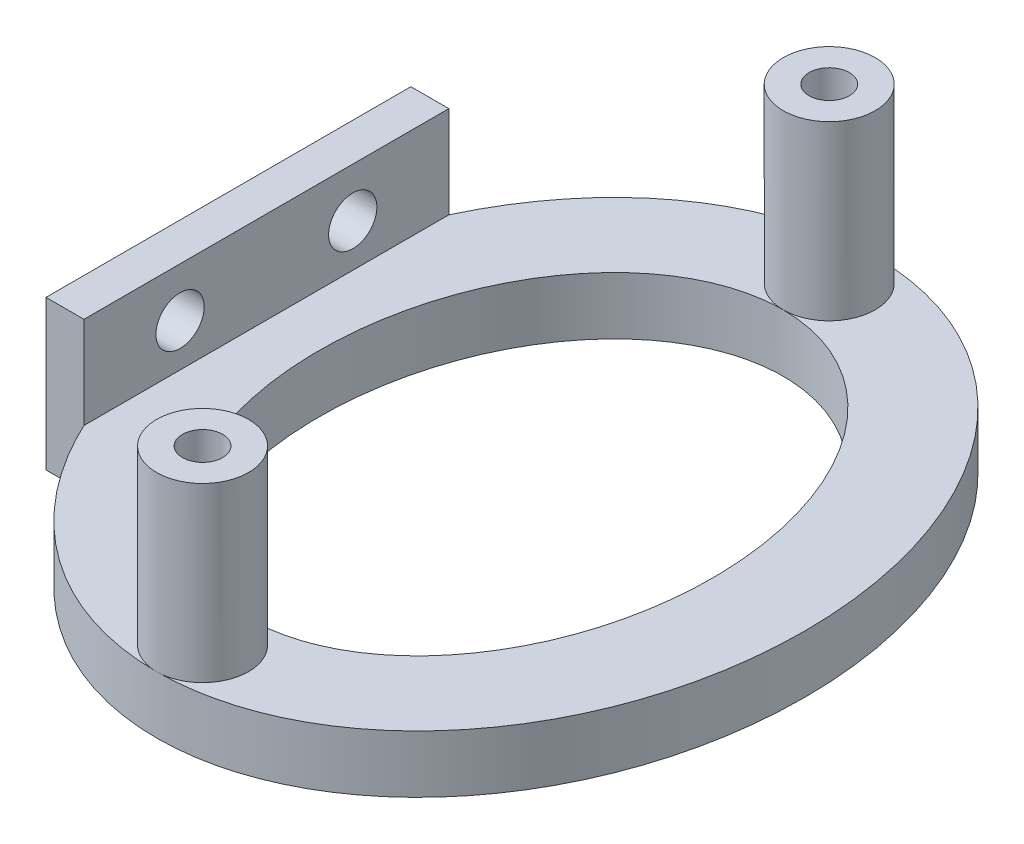
ISO-10303-21;
HEADER;
FILE_DESCRIPTION(('STEP AP214'),'2;1');
FILE_NAME('part.step','',(''),(''),'','','');
FILE_SCHEMA(('AUTOMOTIVE_DESIGN { 1 0 10303 214 1 1 1 1 }'));
ENDSEC;
DATA;
#1=APPLICATION_CONTEXT('core data for automotive mechanical design processes');
#2=APPLICATION_PROTOCOL_DEFINITION('international standard','automotive_design',2000,#1);
#3=PRODUCT_CONTEXT('',#1,'mechanical');
#4=PRODUCT('Part','Part','',(#3));
#5=PRODUCT_RELATED_PRODUCT_CATEGORY('part','',(#4));
#6=PRODUCT_DEFINITION_FORMATION('','',#4);
#7=PRODUCT_DEFINITION_CONTEXT('part definition',#1,'design');
#8=PRODUCT_DEFINITION('design','',#6,#7);
#9=PRODUCT_DEFINITION_SHAPE('','',#8);
#10=(LENGTH_UNIT() NAMED_UNIT(*) SI_UNIT(.MILLI.,.METRE.));
#11=(NAMED_UNIT(*) PLANE_ANGLE_UNIT() SI_UNIT($,.RADIAN.));
#12=(NAMED_UNIT(*) SI_UNIT($,.STERADIAN.) SOLID_ANGLE_UNIT());
#13=UNCERTAINTY_MEASURE_WITH_UNIT(LENGTH_MEASURE(1.E-05),#10,'distance_accuracy_value','');
#14=(GEOMETRIC_REPRESENTATION_CONTEXT(3) GLOBAL_UNCERTAINTY_ASSIGNED_CONTEXT((#13)) GLOBAL_UNIT_ASSIGNED_CONTEXT((#10,
#11,#12)) REPRESENTATION_CONTEXT('',''));
#15=CARTESIAN_POINT('',(0.,0.,0.));
#16=DIRECTION('',(0.,0.,1.));
#17=DIRECTION('',(1.,0.,0.));
#18=AXIS2_PLACEMENT_3D('',#15,#16,#17);
#19=CARTESIAN_POINT('',(0.,118.5,0.));
#20=DIRECTION('',(0.,-1.,0.));
#21=DIRECTION('',(0.,0.,-1.));
#22=AXIS2_PLACEMENT_3D('',#19,#20,#21);
#23=PLANE('',#22);
#24=DIRECTION('',(0.,0.,-1.));
#25=VECTOR('',#24,1.);
#26=CARTESIAN_POINT('',(-21.6975689754204,118.5,0.));
#27=LINE('',#26,#25);
#28=CARTESIAN_POINT('',(-21.6975689754204,118.5,15.8665640867256));
#29=VERTEX_POINT('',#28);
#30=CARTESIAN_POINT('',(-21.6975689754204,118.5,-15.8665640867256));
#31=VERTEX_POINT('',#30);
#32=EDGE_CURVE('E110',#29,#31,#27,.T.);
#33=ORIENTED_EDGE('',*,*,#32,.F.);
#34=CARTESIAN_POINT('',(0.,118.5,31.25));
#35=CARTESIAN_POINT('',(-1.83109247866081,118.5,31.25));
#36=CARTESIAN_POINT('',(-5.49327743598244,118.5,30.7558379448009));
#37=CARTESIAN_POINT('',(-12.2853634768623,118.5,27.9337264933617));
#38=CARTESIAN_POINT('',(-17.2070692289603,118.5,23.3656323528584));
#39=CARTESIAN_POINT('',(-20.8496219565235,118.5,17.7755387236171));
#40=CARTESIAN_POINT('',(-22.5215885515688,118.5,14.192471930694));
#41=CARTESIAN_POINT('',(-24.5042430496665,118.5,8.14074230453279));
#42=CARTESIAN_POINT('',(-25.6175181651569,118.5,0.));
#43=CARTESIAN_POINT('',(-24.5042430496665,118.5,-8.14074230453277));
#44=CARTESIAN_POINT('',(-22.5215885515688,118.5,-14.1924719306939));
#45=CARTESIAN_POINT('',(-20.8496219565235,118.5,-17.7755387236171));
#46=CARTESIAN_POINT('',(-17.2070692289603,118.5,-23.3656323528584));
#47=CARTESIAN_POINT('',(-12.2853634768623,118.5,-27.9337264933617));
#48=CARTESIAN_POINT('',(-5.49327743598244,118.5,-30.7558379448009));
#49=CARTESIAN_POINT('',(0.,118.5,-31.4970810275995));
#50=CARTESIAN_POINT('',(5.49327743598244,118.5,-30.7558379448009));
#51=CARTESIAN_POINT('',(12.2853634768623,118.5,-27.9337264933617));
#52=CARTESIAN_POINT('',(19.0910129579235,118.5,-21.617045025051));
#53=CARTESIAN_POINT('',(24.0185910643609,118.5,-11.4437911212078));
#54=CARTESIAN_POINT('',(25.6798365444114,118.5,0.));
#55=CARTESIAN_POINT('',(24.0185910643609,118.5,11.4437911212078));
#56=CARTESIAN_POINT('',(19.0910129579235,118.5,21.617045025051));
#57=CARTESIAN_POINT('',(12.2853634768623,118.5,27.9337264933617));
#58=CARTESIAN_POINT('',(5.49327743598245,118.5,30.7558379448009));
#59=CARTESIAN_POINT('',(1.83109247866082,118.5,31.25));
#60=CARTESIAN_POINT('',(0.,118.5,31.25));
#61=B_SPLINE_CURVE_WITH_KNOTS('',3,(#34,#35,#36,#37,#38,#39,#40,#41,#42,#43,#44,#45,#46,#47,#48,
#49,#50,#51,#52,#53,#54,#55,#56,#57,#58,#59,#60),.UNSPECIFIED.,.T.,.F.,(4,1,1,1,1,1,1,1,1,1,1,1,
1,1,1,1,1,1,1,1,1,1,1,1,4),(0.,0.196349540849362,0.392699081698724,0.785398163397448,
0.906329291723492,1.10267883257285,1.20085360299754,1.5707963267949,1.94073905059226,
2.03891382101694,2.2352633618663,2.35619449019234,2.74889357189107,2.94524311274043,
3.14159265358979,3.33794219443916,3.53429173528852,3.92699081698724,4.31968989868597,
4.71238898038469,5.10508806208341,5.49778714378214,5.89048622548086,6.08683576633022,
6.28318530717959),.UNSPECIFIED.);
#62=CARTESIAN_POINT('',(0.,118.5,31.25));
#63=VERTEX_POINT('',#62);
#64=EDGE_CURVE('E209',#63,#29,#61,.T.);
#65=ORIENTED_EDGE('',*,*,#64,.F.);
#66=CARTESIAN_POINT('',(0.,118.5,27.25));
#67=DIRECTION('',(0.,-1.,0.));
#68=DIRECTION('',(0.,0.,-1.));
#69=AXIS2_PLACEMENT_3D('',#66,#67,#68);
#70=CIRCLE('',#69,4.);
#71=CARTESIAN_POINT('',(0.,118.5,23.25));
#72=VERTEX_POINT('',#71);
#73=EDGE_CURVE('E42',#63,#72,#70,.T.);
#74=ORIENTED_EDGE('',*,*,#73,.T.);
#75=CARTESIAN_POINT('',(0.,118.5,0.));
#76=DIRECTION('',(0.,-1.,0.));
#77=DIRECTION('',(0.,0.,1.));
#78=AXIS2_PLACEMENT_3D('',#75,#76,#77);
#79=ELLIPSE('',#78,23.25,17.1260880510612);
#80=CARTESIAN_POINT('',(0.,118.5,-23.25));
#81=VERTEX_POINT('',#80);
#82=EDGE_CURVE('E147',#72,#81,#79,.T.);
#83=ORIENTED_EDGE('',*,*,#82,.T.);
#84=CARTESIAN_POINT('',(0.,118.5,-27.25));
#85=DIRECTION('',(0.,-1.,0.));
#86=DIRECTION('',(0.,0.,-1.));
#87=AXIS2_PLACEMENT_3D('',#84,#85,#86);
#88=CIRCLE('',#87,4.);
#89=CARTESIAN_POINT('',(0.,118.5,-31.25));
#90=VERTEX_POINT('',#89);
#91=EDGE_CURVE('E11',#81,#90,#88,.T.);
#92=ORIENTED_EDGE('',*,*,#91,.T.);
#93=EDGE_CURVE('E203',#31,#90,#61,.T.);
#94=ORIENTED_EDGE('',*,*,#93,.F.);
#95=EDGE_LOOP('',(#33,#65,#74,#83,#92,#94));
#96=FACE_BOUND('',#95,.T.);
#97=ADVANCED_FACE('F34',(#96),#23,.F.);
#98=EDGE_CURVE('E208',#90,#63,#61,.T.);
#99=ORIENTED_EDGE('',*,*,#98,.F.);
#100=CARTESIAN_POINT('',(0.,118.5,-27.25));
#101=DIRECTION('',(0.,-1.,0.));
#102=DIRECTION('',(0.,0.,-1.));
#103=AXIS2_PLACEMENT_3D('',#100,#101,#102);
#104=CIRCLE('',#103,4.);
#105=EDGE_CURVE('E48',#90,#81,#104,.T.);
#106=ORIENTED_EDGE('',*,*,#105,.T.);
#107=EDGE_CURVE('E54',#81,#72,#79,.T.);
#108=ORIENTED_EDGE('',*,*,#107,.T.);
#109=EDGE_CURVE('E134',#72,#63,#70,.T.);
#110=ORIENTED_EDGE('',*,*,#109,.T.);
#111=EDGE_LOOP('',(#99,#106,#108,#110));
#112=FACE_BOUND('',#111,.T.);
#113=ADVANCED_FACE('F168',(#112),#23,.F.);
#114=CARTESIAN_POINT('',(0.,113.5,-15.8665640867256));
#115=DIRECTION('',(0.,0.,-1.));
#116=DIRECTION('',(-1.,0.,0.));
#117=AXIS2_PLACEMENT_3D('',#114,#115,#116);
#118=PLANE('',#117);
#119=DIRECTION('',(0.,1.,0.));
#120=VECTOR('',#119,1.);
#121=CARTESIAN_POINT('',(-25.,113.5,-15.8665640867256));
#122=LINE('',#121,#120);
#123=CARTESIAN_POINT('',(-25.,113.5,-15.8665640867256));
#124=VERTEX_POINT('',#123);
#125=CARTESIAN_POINT('',(-25.,126.5,-15.8665640867256));
#126=VERTEX_POINT('',#125);
#127=EDGE_CURVE('E118',#124,#126,#122,.T.);
#128=ORIENTED_EDGE('',*,*,#127,.T.);
#129=DIRECTION('',(-1.,0.,0.));
#130=VECTOR('',#129,1.);
#131=CARTESIAN_POINT('',(0.,126.5,-15.8665640867256));
#132=LINE('',#131,#130);
#133=CARTESIAN_POINT('',(-21.6975689754204,126.5,-15.8665640867256));
#134=VERTEX_POINT('',#133);
#135=EDGE_CURVE('E99',#134,#126,#132,.T.);
#136=ORIENTED_EDGE('',*,*,#135,.F.);
#137=DIRECTION('',(0.,-1.,0.));
#138=VECTOR('',#137,1.);
#139=CARTESIAN_POINT('',(-21.6975689754204,126.5,-15.8665640867256));
#140=LINE('',#139,#138);
#141=EDGE_CURVE('E107',#134,#31,#140,.T.);
#142=ORIENTED_EDGE('',*,*,#141,.T.);
#143=DIRECTION('',(0.,1.,0.));
#144=VECTOR('',#143,1.);
#145=CARTESIAN_POINT('',(-21.6975689754204,113.5,-15.8665640867256));
#146=LINE('',#145,#144);
#147=CARTESIAN_POINT('',(-21.6975689754204,113.5,-15.8665640867256));
#148=VERTEX_POINT('',#147);
#149=EDGE_CURVE('E216',#148,#31,#146,.T.);
#150=ORIENTED_EDGE('',*,*,#149,.F.);
#151=DIRECTION('',(-1.,0.,0.));
#152=VECTOR('',#151,1.);
#153=CARTESIAN_POINT('',(0.,113.5,-15.8665640867256));
#154=LINE('',#153,#152);
#155=EDGE_CURVE('E144',#148,#124,#154,.T.);
#156=ORIENTED_EDGE('',*,*,#155,.T.);
#157=EDGE_LOOP('',(#128,#136,#142,#150,#156));
#158=FACE_BOUND('',#157,.T.);
#159=ADVANCED_FACE('F115',(#158),#118,.T.);
#160=CARTESIAN_POINT('',(-25.,113.5,0.));
#161=DIRECTION('',(1.,0.,0.));
#162=DIRECTION('',(0.,0.,-1.));
#163=AXIS2_PLACEMENT_3D('',#160,#161,#162);
#164=PLANE('',#163);
#165=CARTESIAN_POINT('',(-25.,122.225596062464,7.50848665157555));
#166=DIRECTION('',(1.,0.,0.));
#167=DIRECTION('',(0.,0.,-1.));
#168=AXIS2_PLACEMENT_3D('',#165,#166,#167);
#169=CIRCLE('',#168,2.09999999999999);
#170=CARTESIAN_POINT('',(-25.,122.225596062464,5.40848665157557));
#171=VERTEX_POINT('',#170);
#172=EDGE_CURVE('E122',#171,#171,#169,.T.);
#173=ORIENTED_EDGE('',*,*,#172,.T.);
#174=EDGE_LOOP('',(#173));
#175=FACE_BOUND('',#174,.T.);
#176=CARTESIAN_POINT('',(-25.,122.225596062464,-7.50848665157555));
#177=DIRECTION('',(1.,0.,0.));
#178=DIRECTION('',(0.,0.,-1.));
#179=AXIS2_PLACEMENT_3D('',#176,#177,#178);
#180=CIRCLE('',#179,2.09999999999999);
#181=CARTESIAN_POINT('',(-25.,122.225596062464,-9.60848665157553));
#182=VERTEX_POINT('',#181);
#183=EDGE_CURVE('E399',#182,#182,#180,.T.);
#184=ORIENTED_EDGE('',*,*,#183,.T.);
#185=EDGE_LOOP('',(#184));
#186=FACE_BOUND('',#185,.T.);
#187=DIRECTION('',(0.,1.,0.));
#188=VECTOR('',#187,1.);
#189=CARTESIAN_POINT('',(-25.,113.5,15.8665640867256));
#190=LINE('',#189,#188);
#191=CARTESIAN_POINT('',(-25.,113.5,15.8665640867256));
#192=VERTEX_POINT('',#191);
#193=CARTESIAN_POINT('',(-25.,126.5,15.8665640867256));
#194=VERTEX_POINT('',#193);
#195=EDGE_CURVE('E221',#192,#194,#190,.T.);
#196=ORIENTED_EDGE('',*,*,#195,.T.);
#197=DIRECTION('',(0.,0.,-1.));
#198=VECTOR('',#197,1.);
#199=CARTESIAN_POINT('',(-25.,126.5,0.));
#200=LINE('',#199,#198);
#201=EDGE_CURVE('E104',#194,#126,#200,.T.);
#202=ORIENTED_EDGE('',*,*,#201,.T.);
#203=ORIENTED_EDGE('',*,*,#127,.F.);
#204=DIRECTION('',(0.,0.,-1.));
#205=VECTOR('',#204,1.);
#206=CARTESIAN_POINT('',(-25.,113.5,0.));
#207=LINE('',#206,#205);
#208=EDGE_CURVE('E153',#192,#124,#207,.T.);
#209=ORIENTED_EDGE('',*,*,#208,.F.);
#210=EDGE_LOOP('',(#196,#202,#203,#209));
#211=FACE_BOUND('',#210,.T.);
#212=ADVANCED_FACE('F165',(#175,#186,#211),#164,.F.);
#213=CARTESIAN_POINT('',(0.,113.5,27.25));
#214=DIRECTION('',(0.,1.,0.));
#215=DIRECTION('',(0.,0.,1.));
#216=AXIS2_PLACEMENT_3D('',#213,#214,#215);
#217=CYLINDRICAL_SURFACE('',#216,1.75);
#218=CARTESIAN_POINT('',(0.,113.5,27.25));
#219=DIRECTION('',(0.,-1.,0.));
#220=DIRECTION('',(0.,0.,-1.));
#221=AXIS2_PLACEMENT_3D('',#218,#219,#220);
#222=CIRCLE('',#221,1.75);
#223=CARTESIAN_POINT('',(0.,113.5,25.5));
#224=VERTEX_POINT('',#223);
#225=EDGE_CURVE('E200',#224,#224,#222,.T.);
#226=ORIENTED_EDGE('',*,*,#225,.T.);
#227=EDGE_LOOP('',(#226));
#228=FACE_BOUND('',#227,.T.);
#229=CARTESIAN_POINT('',(0.,133.5,27.25));
#230=DIRECTION('',(0.,-1.,0.));
#231=DIRECTION('',(0.,0.,-1.));
#232=AXIS2_PLACEMENT_3D('',#229,#230,#231);
#233=CIRCLE('',#232,1.75);
#234=CARTESIAN_POINT('',(0.,133.5,25.5));
#235=VERTEX_POINT('',#234);
#236=EDGE_CURVE('E136',#235,#235,#233,.T.);
#237=ORIENTED_EDGE('',*,*,#236,.F.);
#238=EDGE_LOOP('',(#237));
#239=FACE_BOUND('',#238,.T.);
#240=ADVANCED_FACE('F173',(#228,#239),#217,.F.);
#241=CARTESIAN_POINT('',(0.,113.5,-27.25));
#242=DIRECTION('',(0.,1.,0.));
#243=DIRECTION('',(0.,0.,1.));
#244=AXIS2_PLACEMENT_3D('',#241,#242,#243);
#245=CYLINDRICAL_SURFACE('',#244,1.75);
#246=CARTESIAN_POINT('',(0.,113.5,-27.25));
#247=DIRECTION('',(0.,-1.,0.));
#248=DIRECTION('',(0.,0.,-1.));
#249=AXIS2_PLACEMENT_3D('',#246,#247,#248);
#250=CIRCLE('',#249,1.75);
#251=CARTESIAN_POINT('',(0.,113.5,-29.));
#252=VERTEX_POINT('',#251);
#253=EDGE_CURVE('E197',#252,#252,#250,.T.);
#254=ORIENTED_EDGE('',*,*,#253,.T.);
#255=EDGE_LOOP('',(#254));
#256=FACE_BOUND('',#255,.T.);
#257=CARTESIAN_POINT('',(0.,133.5,-27.25));
#258=DIRECTION('',(0.,-1.,0.));
#259=DIRECTION('',(0.,0.,-1.));
#260=AXIS2_PLACEMENT_3D('',#257,#258,#259);
#261=CIRCLE('',#260,1.75);
#262=CARTESIAN_POINT('',(0.,133.5,-29.));
#263=VERTEX_POINT('',#262);
#264=EDGE_CURVE('E128',#263,#263,#261,.T.);
#265=ORIENTED_EDGE('',*,*,#264,.F.);
#266=EDGE_LOOP('',(#265));
#267=FACE_BOUND('',#266,.T.);
#268=ADVANCED_FACE('F187',(#256,#267),#245,.F.);
#269=CARTESIAN_POINT('',(0.,113.5,0.));
#270=DIRECTION('',(0.,-1.,0.));
#271=DIRECTION('',(0.,0.,1.));
#272=AXIS2_PLACEMENT_3D('',#269,#270,#271);
#273=ELLIPSE('',#272,23.25,17.1260880510612);
#274=DIRECTION('',(0.,1.,0.));
#275=VECTOR('',#274,1.);
#276=SURFACE_OF_LINEAR_EXTRUSION('',#273,#275);
#277=CARTESIAN_POINT('',(0.,113.5,23.25));
#278=VERTEX_POINT('',#277);
#279=EDGE_CURVE('E193',#278,#278,#273,.T.);
#280=ORIENTED_EDGE('',*,*,#279,.T.);
#281=EDGE_LOOP('',(#280));
#282=FACE_BOUND('',#281,.T.);
#283=ORIENTED_EDGE('',*,*,#82,.F.);
#284=ORIENTED_EDGE('',*,*,#107,.F.);
#285=EDGE_LOOP('',(#283,#284));
#286=FACE_BOUND('',#285,.T.);
#287=ADVANCED_FACE('F163',(#282,#286),#276,.T.);
#288=CARTESIAN_POINT('',(0.,113.5,31.25));
#289=CARTESIAN_POINT('',(-1.83109247866081,113.5,31.25));
#290=CARTESIAN_POINT('',(-5.49327743598244,113.5,30.7558379448009));
#291=CARTESIAN_POINT('',(-12.2853634768623,113.5,27.9337264933617));
#292=CARTESIAN_POINT('',(-17.2070692289603,113.5,23.3656323528584));
#293=CARTESIAN_POINT('',(-20.8496219565235,113.5,17.7755387236171));
#294=CARTESIAN_POINT('',(-22.5215885515688,113.5,14.192471930694));
#295=CARTESIAN_POINT('',(-24.5042430496665,113.5,8.14074230453279));
#296=CARTESIAN_POINT('',(-25.6175181651569,113.5,0.));
#297=CARTESIAN_POINT('',(-24.5042430496665,113.5,-8.14074230453277));
#298=CARTESIAN_POINT('',(-22.5215885515688,113.5,-14.1924719306939));
#299=CARTESIAN_POINT('',(-20.8496219565235,113.5,-17.7755387236171));
#300=CARTESIAN_POINT('',(-17.2070692289603,113.5,-23.3656323528584));
#301=CARTESIAN_POINT('',(-12.2853634768623,113.5,-27.9337264933617));
#302=CARTESIAN_POINT('',(-5.49327743598244,113.5,-30.7558379448009));
#303=CARTESIAN_POINT('',(0.,113.5,-31.4970810275995));
#304=CARTESIAN_POINT('',(5.49327743598244,113.5,-30.7558379448009));
#305=CARTESIAN_POINT('',(12.2853634768623,113.5,-27.9337264933617));
#306=CARTESIAN_POINT('',(19.0910129579235,113.5,-21.617045025051));
#307=CARTESIAN_POINT('',(24.0185910643609,113.5,-11.4437911212078));
#308=CARTESIAN_POINT('',(25.6798365444114,113.5,0.));
#309=CARTESIAN_POINT('',(24.0185910643609,113.5,11.4437911212078));
#310=CARTESIAN_POINT('',(19.0910129579235,113.5,21.617045025051));
#311=CARTESIAN_POINT('',(12.2853634768623,113.5,27.9337264933617));
#312=CARTESIAN_POINT('',(5.49327743598245,113.5,30.7558379448009));
#313=CARTESIAN_POINT('',(1.83109247866082,113.5,31.25));
#314=CARTESIAN_POINT('',(0.,113.5,31.25));
#315=B_SPLINE_CURVE_WITH_KNOTS('',3,(#288,#289,#290,#291,#292,#293,#294,#295,#296,#297,#298,
#299,#300,#301,#302,#303,#304,#305,#306,#307,#308,#309,#310,#311,#312,#313,#314),.UNSPECIFIED.,
.T.,.F.,(4,1,1,1,1,1,1,1,1,1,1,1,1,1,1,1,1,1,1,1,1,1,1,1,4),(0.,0.196349540849362,
0.392699081698724,0.785398163397448,0.906329291723492,1.10267883257285,1.20085360299754,
1.5707963267949,1.94073905059226,2.03891382101694,2.2352633618663,2.35619449019234,
2.74889357189107,2.94524311274043,3.14159265358979,3.33794219443916,3.53429173528852,
3.92699081698724,4.31968989868597,4.71238898038469,5.10508806208341,5.49778714378214,
5.89048622548086,6.08683576633022,6.28318530717959),.UNSPECIFIED.);
#316=DIRECTION('',(0.,1.,0.));
#317=VECTOR('',#316,1.);
#318=SURFACE_OF_LINEAR_EXTRUSION('',#315,#317);
#319=ORIENTED_EDGE('',*,*,#93,.T.);
#320=ORIENTED_EDGE('',*,*,#98,.T.);
#321=ORIENTED_EDGE('',*,*,#64,.T.);
#322=DIRECTION('',(0.,1.,0.));
#323=VECTOR('',#322,1.);
#324=CARTESIAN_POINT('',(-21.6975689754205,113.5,15.8665640867256));
#325=LINE('',#324,#323);
#326=CARTESIAN_POINT('',(-21.6975689559466,113.5,15.86656412831));
#327=VERTEX_POINT('',#326);
#328=EDGE_CURVE('E218',#29,#327,#325,.F.);
#329=ORIENTED_EDGE('',*,*,#328,.T.);
#330=EDGE_CURVE('E146',#148,#327,#315,.T.);
#331=ORIENTED_EDGE('',*,*,#330,.F.);
#332=ORIENTED_EDGE('',*,*,#149,.T.);
#333=EDGE_LOOP('',(#319,#320,#321,#329,#331,#332));
#334=FACE_BOUND('',#333,.T.);
#335=ADVANCED_FACE('F159',(#334),#318,.F.);
#336=CARTESIAN_POINT('',(0.,113.5,0.));
#337=DIRECTION('',(0.,-1.,0.));
#338=DIRECTION('',(0.,0.,-1.));
#339=AXIS2_PLACEMENT_3D('',#336,#337,#338);
#340=PLANE('',#339);
#341=ORIENTED_EDGE('',*,*,#330,.T.);
#342=DIRECTION('',(-1.,0.,0.));
#343=VECTOR('',#342,1.);
#344=CARTESIAN_POINT('',(-21.6975689754204,113.5,15.8665640867256));
#345=LINE('',#344,#343);
#346=EDGE_CURVE('E142',#327,#192,#345,.T.);
#347=ORIENTED_EDGE('',*,*,#346,.T.);
#348=ORIENTED_EDGE('',*,*,#208,.T.);
#349=ORIENTED_EDGE('',*,*,#155,.F.);
#350=EDGE_LOOP('',(#341,#347,#348,#349));
#351=FACE_BOUND('',#350,.T.);
#352=ORIENTED_EDGE('',*,*,#279,.F.);
#353=EDGE_LOOP('',(#352));
#354=FACE_BOUND('',#353,.T.);
#355=ORIENTED_EDGE('',*,*,#253,.F.);
#356=EDGE_LOOP('',(#355));
#357=FACE_BOUND('',#356,.T.);
#358=ORIENTED_EDGE('',*,*,#225,.F.);
#359=EDGE_LOOP('',(#358));
#360=FACE_BOUND('',#359,.T.);
#361=ADVANCED_FACE('F162',(#351,#354,#357,#360),#340,.T.);
#362=CARTESIAN_POINT('',(-21.6975689754204,113.5,15.8665640867256));
#363=DIRECTION('',(0.,0.,-1.));
#364=DIRECTION('',(-1.,0.,0.));
#365=AXIS2_PLACEMENT_3D('',#362,#363,#364);
#366=PLANE('',#365);
#367=ORIENTED_EDGE('',*,*,#328,.F.);
#368=DIRECTION('',(0.,-1.,0.));
#369=VECTOR('',#368,1.);
#370=CARTESIAN_POINT('',(-21.6975689754204,126.5,15.8665640867256));
#371=LINE('',#370,#369);
#372=CARTESIAN_POINT('',(-21.6975689754204,126.5,15.8665640867256));
#373=VERTEX_POINT('',#372);
#374=EDGE_CURVE('E113',#373,#29,#371,.T.);
#375=ORIENTED_EDGE('',*,*,#374,.F.);
#376=DIRECTION('',(-1.,0.,0.));
#377=VECTOR('',#376,1.);
#378=CARTESIAN_POINT('',(-21.6975689754204,126.5,15.8665640867256));
#379=LINE('',#378,#377);
#380=EDGE_CURVE('E102',#373,#194,#379,.T.);
#381=ORIENTED_EDGE('',*,*,#380,.T.);
#382=ORIENTED_EDGE('',*,*,#195,.F.);
#383=ORIENTED_EDGE('',*,*,#346,.F.);
#384=EDGE_LOOP('',(#367,#375,#381,#382,#383));
#385=FACE_BOUND('',#384,.T.);
#386=ADVANCED_FACE('F36',(#385),#366,.F.);
#387=CARTESIAN_POINT('',(0.,133.5,27.25));
#388=DIRECTION('',(0.,-1.,0.));
#389=DIRECTION('',(0.,0.,-1.));
#390=AXIS2_PLACEMENT_3D('',#387,#388,#389);
#391=CYLINDRICAL_SURFACE('',#390,4.);
#392=CARTESIAN_POINT('',(0.,133.5,27.25));
#393=DIRECTION('',(0.,-1.,0.));
#394=DIRECTION('',(0.,0.,-1.));
#395=AXIS2_PLACEMENT_3D('',#392,#393,#394);
#396=CIRCLE('',#395,4.);
#397=CARTESIAN_POINT('',(0.,133.5,23.25));
#398=VERTEX_POINT('',#397);
#399=EDGE_CURVE('E139',#398,#398,#396,.T.);
#400=ORIENTED_EDGE('',*,*,#399,.T.);
#401=EDGE_LOOP('',(#400));
#402=FACE_BOUND('',#401,.T.);
#403=ORIENTED_EDGE('',*,*,#109,.F.);
#404=ORIENTED_EDGE('',*,*,#73,.F.);
#405=EDGE_LOOP('',(#403,#404));
#406=FACE_BOUND('',#405,.T.);
#407=ADVANCED_FACE('F232',(#402,#406),#391,.T.);
#408=CARTESIAN_POINT('',(0.,133.5,0.));
#409=DIRECTION('',(0.,-1.,0.));
#410=DIRECTION('',(0.,0.,-1.));
#411=AXIS2_PLACEMENT_3D('',#408,#409,#410);
#412=PLANE('',#411);
#413=ORIENTED_EDGE('',*,*,#236,.T.);
#414=EDGE_LOOP('',(#413));
#415=FACE_BOUND('',#414,.T.);
#416=ORIENTED_EDGE('',*,*,#399,.F.);
#417=EDGE_LOOP('',(#416));
#418=FACE_BOUND('',#417,.T.);
#419=ADVANCED_FACE('F238',(#415,#418),#412,.F.);
#420=CARTESIAN_POINT('',(0.,133.5,-27.25));
#421=DIRECTION('',(0.,-1.,0.));
#422=DIRECTION('',(0.,0.,-1.));
#423=AXIS2_PLACEMENT_3D('',#420,#421,#422);
#424=CYLINDRICAL_SURFACE('',#423,4.);
#425=CARTESIAN_POINT('',(0.,133.5,-27.25));
#426=DIRECTION('',(0.,-1.,0.));
#427=DIRECTION('',(0.,0.,-1.));
#428=AXIS2_PLACEMENT_3D('',#425,#426,#427);
#429=CIRCLE('',#428,4.);
#430=CARTESIAN_POINT('',(0.,133.5,-31.25));
#431=VERTEX_POINT('',#430);
#432=EDGE_CURVE('E131',#431,#431,#429,.T.);
#433=ORIENTED_EDGE('',*,*,#432,.T.);
#434=EDGE_LOOP('',(#433));
#435=FACE_BOUND('',#434,.T.);
#436=ORIENTED_EDGE('',*,*,#105,.F.);
#437=ORIENTED_EDGE('',*,*,#91,.F.);
#438=EDGE_LOOP('',(#436,#437));
#439=FACE_BOUND('',#438,.T.);
#440=ADVANCED_FACE('F234',(#435,#439),#424,.T.);
#441=CARTESIAN_POINT('',(0.,133.5,0.));
#442=DIRECTION('',(0.,-1.,0.));
#443=DIRECTION('',(0.,0.,-1.));
#444=AXIS2_PLACEMENT_3D('',#441,#442,#443);
#445=PLANE('',#444);
#446=ORIENTED_EDGE('',*,*,#264,.T.);
#447=EDGE_LOOP('',(#446));
#448=FACE_BOUND('',#447,.T.);
#449=ORIENTED_EDGE('',*,*,#432,.F.);
#450=EDGE_LOOP('',(#449));
#451=FACE_BOUND('',#450,.T.);
#452=ADVANCED_FACE('F237',(#448,#451),#445,.F.);
#453=CARTESIAN_POINT('',(-21.6975689754204,126.5,0.));
#454=DIRECTION('',(-1.,0.,0.));
#455=DIRECTION('',(0.,0.,1.));
#456=AXIS2_PLACEMENT_3D('',#453,#454,#455);
#457=PLANE('',#456);
#458=CARTESIAN_POINT('',(-21.6975689754204,122.225596062464,7.50848665157555));
#459=DIRECTION('',(1.,0.,0.));
#460=DIRECTION('',(0.,0.,-1.));
#461=AXIS2_PLACEMENT_3D('',#458,#459,#460);
#462=CIRCLE('',#461,2.09999999999999);
#463=CARTESIAN_POINT('',(-21.6975689754204,122.225596062464,5.40848665157557));
#464=VERTEX_POINT('',#463);
#465=EDGE_CURVE('E396',#464,#464,#462,.T.);
#466=ORIENTED_EDGE('',*,*,#465,.F.);
#467=EDGE_LOOP('',(#466));
#468=FACE_BOUND('',#467,.T.);
#469=CARTESIAN_POINT('',(-21.6975689754204,122.225596062464,-7.50848665157555));
#470=DIRECTION('',(1.,0.,0.));
#471=DIRECTION('',(0.,0.,-1.));
#472=AXIS2_PLACEMENT_3D('',#469,#470,#471);
#473=CIRCLE('',#472,2.09999999999999);
#474=CARTESIAN_POINT('',(-21.6975689754204,122.225596062464,-9.60848665157553));
#475=VERTEX_POINT('',#474);
#476=EDGE_CURVE('E403',#475,#475,#473,.T.);
#477=ORIENTED_EDGE('',*,*,#476,.F.);
#478=EDGE_LOOP('',(#477));
#479=FACE_BOUND('',#478,.T.);
#480=ORIENTED_EDGE('',*,*,#32,.T.);
#481=ORIENTED_EDGE('',*,*,#141,.F.);
#482=DIRECTION('',(0.,0.,-1.));
#483=VECTOR('',#482,1.);
#484=CARTESIAN_POINT('',(-21.6975689754204,126.5,0.));
#485=LINE('',#484,#483);
#486=EDGE_CURVE('E94',#373,#134,#485,.T.);
#487=ORIENTED_EDGE('',*,*,#486,.F.);
#488=ORIENTED_EDGE('',*,*,#374,.T.);
#489=EDGE_LOOP('',(#480,#481,#487,#488));
#490=FACE_BOUND('',#489,.T.);
#491=ADVANCED_FACE('F108',(#468,#479,#490),#457,.F.);
#492=CARTESIAN_POINT('',(0.,126.5,0.));
#493=DIRECTION('',(0.,-1.,0.));
#494=DIRECTION('',(0.,0.,-1.));
#495=AXIS2_PLACEMENT_3D('',#492,#493,#494);
#496=PLANE('',#495);
#497=ORIENTED_EDGE('',*,*,#135,.T.);
#498=ORIENTED_EDGE('',*,*,#201,.F.);
#499=ORIENTED_EDGE('',*,*,#380,.F.);
#500=ORIENTED_EDGE('',*,*,#486,.T.);
#501=EDGE_LOOP('',(#497,#498,#499,#500));
#502=FACE_BOUND('',#501,.T.);
#503=ADVANCED_FACE('F96',(#502),#496,.F.);
#504=CARTESIAN_POINT('',(-31.6975689754204,122.225596062464,-7.50848665157555));
#505=DIRECTION('',(1.,0.,0.));
#506=DIRECTION('',(0.,0.,-1.));
#507=AXIS2_PLACEMENT_3D('',#504,#505,#506);
#508=CYLINDRICAL_SURFACE('',#507,2.09999999999999);
#509=ORIENTED_EDGE('',*,*,#476,.T.);
#510=EDGE_LOOP('',(#509));
#511=FACE_BOUND('',#510,.T.);
#512=ORIENTED_EDGE('',*,*,#183,.F.);
#513=EDGE_LOOP('',(#512));
#514=FACE_BOUND('',#513,.T.);
#515=ADVANCED_FACE('F353',(#511,#514),#508,.F.);
#516=CARTESIAN_POINT('',(-31.6975689754204,122.225596062464,7.50848665157556));
#517=DIRECTION('',(1.,0.,0.));
#518=DIRECTION('',(0.,0.,-1.));
#519=AXIS2_PLACEMENT_3D('',#516,#517,#518);
#520=CYLINDRICAL_SURFACE('',#519,2.09999999999999);
#521=ORIENTED_EDGE('',*,*,#465,.T.);
#522=EDGE_LOOP('',(#521));
#523=FACE_BOUND('',#522,.T.);
#524=ORIENTED_EDGE('',*,*,#172,.F.);
#525=EDGE_LOOP('',(#524));
#526=FACE_BOUND('',#525,.T.);
#527=ADVANCED_FACE('F369',(#523,#526),#520,.F.);
#528=CLOSED_SHELL('',(#97,#113,#159,#212,#240,#268,#287,#335,#361,#386,#407,#419,#440,#452,#491,
#503,#515,#527));
#529=MANIFOLD_SOLID_BREP('B2',#528);
#530=ADVANCED_BREP_SHAPE_REPRESENTATION('',(#18,#529),#14);
#531=SHAPE_DEFINITION_REPRESENTATION(#9,#530);
ENDSEC;
END-ISO-10303-21;
